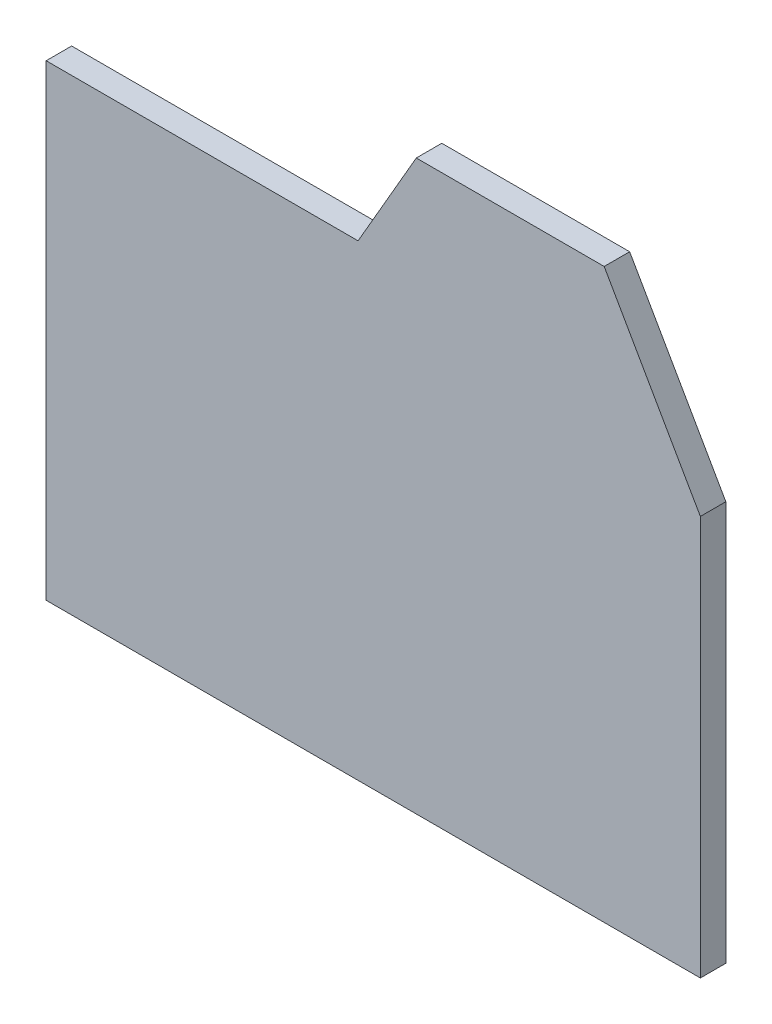
ISO-10303-21;
HEADER;
FILE_DESCRIPTION(('STEP AP214'),'2;1');
FILE_NAME('part.step','',(''),(''),'','','');
FILE_SCHEMA(('AUTOMOTIVE_DESIGN { 1 0 10303 214 1 1 1 1 }'));
ENDSEC;
DATA;
#1=APPLICATION_CONTEXT('core data for automotive mechanical design processes');
#2=APPLICATION_PROTOCOL_DEFINITION('international standard','automotive_design',2000,#1);
#3=PRODUCT_CONTEXT('',#1,'mechanical');
#4=PRODUCT('Part','Part','',(#3));
#5=PRODUCT_RELATED_PRODUCT_CATEGORY('part','',(#4));
#6=PRODUCT_DEFINITION_FORMATION('','',#4);
#7=PRODUCT_DEFINITION_CONTEXT('part definition',#1,'design');
#8=PRODUCT_DEFINITION('design','',#6,#7);
#9=PRODUCT_DEFINITION_SHAPE('','',#8);
#10=(LENGTH_UNIT() NAMED_UNIT(*) SI_UNIT(.MILLI.,.METRE.));
#11=(NAMED_UNIT(*) PLANE_ANGLE_UNIT() SI_UNIT($,.RADIAN.));
#12=(NAMED_UNIT(*) SI_UNIT($,.STERADIAN.) SOLID_ANGLE_UNIT());
#13=UNCERTAINTY_MEASURE_WITH_UNIT(LENGTH_MEASURE(1.E-05),#10,'distance_accuracy_value','');
#14=(GEOMETRIC_REPRESENTATION_CONTEXT(3) GLOBAL_UNCERTAINTY_ASSIGNED_CONTEXT((#13)) GLOBAL_UNIT_ASSIGNED_CONTEXT((#10,
#11,#12)) REPRESENTATION_CONTEXT('',''));
#15=CARTESIAN_POINT('',(0.,0.,0.));
#16=DIRECTION('',(0.,0.,1.));
#17=DIRECTION('',(1.,0.,0.));
#18=AXIS2_PLACEMENT_3D('',#15,#16,#17);
#19=CARTESIAN_POINT('',(78.3220894613165,44.7341186455737,3.));
#20=DIRECTION('',(0.868345141419592,0.495960396980433,0.));
#21=DIRECTION('',(-0.495960396980433,0.868345141419592,0.));
#22=AXIS2_PLACEMENT_3D('',#19,#20,#21);
#23=PLANE('',#22);
#24=DIRECTION('',(0.495960396980433,-0.868345141419592,0.));
#25=VECTOR('',#24,1.);
#26=CARTESIAN_POINT('',(78.3220894613165,44.7341186455737,0.));
#27=LINE('',#26,#25);
#28=CARTESIAN_POINT('',(65.6794,66.86939,0.));
#29=VERTEX_POINT('',#28);
#30=CARTESIAN_POINT('',(77.,47.04888,0.));
#31=VERTEX_POINT('',#30);
#32=EDGE_CURVE('E129',#29,#31,#27,.T.);
#33=ORIENTED_EDGE('',*,*,#32,.F.);
#34=DIRECTION('',(0.,0.,-1.));
#35=VECTOR('',#34,1.);
#36=CARTESIAN_POINT('',(65.6794,66.86939,3.));
#37=LINE('',#36,#35);
#38=CARTESIAN_POINT('',(65.6794,66.86939,3.));
#39=VERTEX_POINT('',#38);
#40=EDGE_CURVE('E11',#39,#29,#37,.T.);
#41=ORIENTED_EDGE('',*,*,#40,.F.);
#42=DIRECTION('',(0.495960396980433,-0.868345141419592,0.));
#43=VECTOR('',#42,1.);
#44=CARTESIAN_POINT('',(78.3220894613165,44.7341186455737,3.));
#45=LINE('',#44,#43);
#46=CARTESIAN_POINT('',(77.,47.04888,3.));
#47=VERTEX_POINT('',#46);
#48=EDGE_CURVE('E145',#39,#47,#45,.T.);
#49=ORIENTED_EDGE('',*,*,#48,.T.);
#50=DIRECTION('',(0.,0.,-1.));
#51=VECTOR('',#50,1.);
#52=CARTESIAN_POINT('',(77.,47.04888,3.));
#53=LINE('',#52,#51);
#54=EDGE_CURVE('E88',#47,#31,#53,.T.);
#55=ORIENTED_EDGE('',*,*,#54,.T.);
#56=EDGE_LOOP('',(#33,#41,#49,#55));
#57=FACE_BOUND('',#56,.T.);
#58=ADVANCED_FACE('F41',(#57),#23,.T.);
#59=CARTESIAN_POINT('',(0.,66.86939,3.));
#60=DIRECTION('',(0.,1.,0.));
#61=DIRECTION('',(0.,0.,1.));
#62=AXIS2_PLACEMENT_3D('',#59,#60,#61);
#63=PLANE('',#62);
#64=DIRECTION('',(1.,0.,0.));
#65=VECTOR('',#64,1.);
#66=CARTESIAN_POINT('',(0.,66.86939,0.));
#67=LINE('',#66,#65);
#68=CARTESIAN_POINT('',(43.56615,66.86939,0.));
#69=VERTEX_POINT('',#68);
#70=EDGE_CURVE('E132',#69,#29,#67,.T.);
#71=ORIENTED_EDGE('',*,*,#70,.F.);
#72=DIRECTION('',(0.,0.,-1.));
#73=VECTOR('',#72,1.);
#74=CARTESIAN_POINT('',(43.56615,66.86939,3.));
#75=LINE('',#74,#73);
#76=CARTESIAN_POINT('',(43.56615,66.86939,3.));
#77=VERTEX_POINT('',#76);
#78=EDGE_CURVE('E49',#77,#69,#75,.T.);
#79=ORIENTED_EDGE('',*,*,#78,.F.);
#80=DIRECTION('',(1.,0.,0.));
#81=VECTOR('',#80,1.);
#82=CARTESIAN_POINT('',(0.,66.86939,3.));
#83=LINE('',#82,#81);
#84=EDGE_CURVE('E164',#77,#39,#83,.T.);
#85=ORIENTED_EDGE('',*,*,#84,.T.);
#86=ORIENTED_EDGE('',*,*,#40,.T.);
#87=EDGE_LOOP('',(#71,#79,#85,#86));
#88=FACE_BOUND('',#87,.T.);
#89=ADVANCED_FACE('F158',(#88),#63,.T.);
#90=CARTESIAN_POINT('',(3.71929707931593,-2.14733857638313,3.));
#91=DIRECTION('',(-0.866025261979014,0.50000024561412,0.));
#92=DIRECTION('',(-0.50000024561412,-0.866025261979014,0.));
#93=AXIS2_PLACEMENT_3D('',#90,#91,#92);
#94=PLANE('',#93);
#95=DIRECTION('',(0.50000024561412,0.866025261979014,0.));
#96=VECTOR('',#95,1.);
#97=CARTESIAN_POINT('',(3.71929707931593,-2.14733857638313,0.));
#98=LINE('',#97,#96);
#99=CARTESIAN_POINT('',(36.71335,55.,0.));
#100=VERTEX_POINT('',#99);
#101=EDGE_CURVE('E135',#100,#69,#98,.T.);
#102=ORIENTED_EDGE('',*,*,#101,.F.);
#103=DIRECTION('',(0.,0.,-1.));
#104=VECTOR('',#103,1.);
#105=CARTESIAN_POINT('',(36.71335,55.,3.));
#106=LINE('',#105,#104);
#107=CARTESIAN_POINT('',(36.71335,55.,3.));
#108=VERTEX_POINT('',#107);
#109=EDGE_CURVE('E149',#108,#100,#106,.T.);
#110=ORIENTED_EDGE('',*,*,#109,.F.);
#111=DIRECTION('',(0.50000024561412,0.866025261979014,0.));
#112=VECTOR('',#111,1.);
#113=CARTESIAN_POINT('',(3.71929707931593,-2.14733857638313,3.));
#114=LINE('',#113,#112);
#115=EDGE_CURVE('E124',#108,#77,#114,.T.);
#116=ORIENTED_EDGE('',*,*,#115,.T.);
#117=ORIENTED_EDGE('',*,*,#78,.T.);
#118=EDGE_LOOP('',(#102,#110,#116,#117));
#119=FACE_BOUND('',#118,.T.);
#120=ADVANCED_FACE('F154',(#119),#94,.T.);
#121=CARTESIAN_POINT('',(0.,55.,3.));
#122=DIRECTION('',(0.,1.,0.));
#123=DIRECTION('',(0.,0.,1.));
#124=AXIS2_PLACEMENT_3D('',#121,#122,#123);
#125=PLANE('',#124);
#126=DIRECTION('',(1.,0.,0.));
#127=VECTOR('',#126,1.);
#128=CARTESIAN_POINT('',(0.,55.,0.));
#129=LINE('',#128,#127);
#130=CARTESIAN_POINT('',(0.,55.,0.));
#131=VERTEX_POINT('',#130);
#132=EDGE_CURVE('E138',#131,#100,#129,.T.);
#133=ORIENTED_EDGE('',*,*,#132,.F.);
#134=DIRECTION('',(0.,0.,-1.));
#135=VECTOR('',#134,1.);
#136=CARTESIAN_POINT('',(0.,55.,3.));
#137=LINE('',#136,#135);
#138=CARTESIAN_POINT('',(0.,55.,3.));
#139=VERTEX_POINT('',#138);
#140=EDGE_CURVE('E112',#139,#131,#137,.T.);
#141=ORIENTED_EDGE('',*,*,#140,.F.);
#142=DIRECTION('',(1.,0.,0.));
#143=VECTOR('',#142,1.);
#144=CARTESIAN_POINT('',(0.,55.,3.));
#145=LINE('',#144,#143);
#146=EDGE_CURVE('E122',#139,#108,#145,.T.);
#147=ORIENTED_EDGE('',*,*,#146,.T.);
#148=ORIENTED_EDGE('',*,*,#109,.T.);
#149=EDGE_LOOP('',(#133,#141,#147,#148));
#150=FACE_BOUND('',#149,.T.);
#151=ADVANCED_FACE('F163',(#150),#125,.T.);
#152=CARTESIAN_POINT('',(0.,0.,3.));
#153=DIRECTION('',(-1.,0.,0.));
#154=DIRECTION('',(0.,0.,1.));
#155=AXIS2_PLACEMENT_3D('',#152,#153,#154);
#156=PLANE('',#155);
#157=DIRECTION('',(0.,1.,0.));
#158=VECTOR('',#157,1.);
#159=CARTESIAN_POINT('',(0.,0.,0.));
#160=LINE('',#159,#158);
#161=CARTESIAN_POINT('',(0.,0.,0.));
#162=VERTEX_POINT('',#161);
#163=EDGE_CURVE('E111',#162,#131,#160,.T.);
#164=ORIENTED_EDGE('',*,*,#163,.F.);
#165=DIRECTION('',(0.,0.,-1.));
#166=VECTOR('',#165,1.);
#167=CARTESIAN_POINT('',(0.,0.,3.));
#168=LINE('',#167,#166);
#169=CARTESIAN_POINT('',(0.,0.,3.));
#170=VERTEX_POINT('',#169);
#171=EDGE_CURVE('E105',#170,#162,#168,.T.);
#172=ORIENTED_EDGE('',*,*,#171,.F.);
#173=DIRECTION('',(0.,1.,0.));
#174=VECTOR('',#173,1.);
#175=CARTESIAN_POINT('',(0.,0.,3.));
#176=LINE('',#175,#174);
#177=EDGE_CURVE('E109',#170,#139,#176,.T.);
#178=ORIENTED_EDGE('',*,*,#177,.T.);
#179=ORIENTED_EDGE('',*,*,#140,.T.);
#180=EDGE_LOOP('',(#164,#172,#178,#179));
#181=FACE_BOUND('',#180,.T.);
#182=ADVANCED_FACE('F107',(#181),#156,.T.);
#183=CARTESIAN_POINT('',(0.,0.,3.));
#184=DIRECTION('',(0.,1.,0.));
#185=DIRECTION('',(0.,0.,1.));
#186=AXIS2_PLACEMENT_3D('',#183,#184,#185);
#187=PLANE('',#186);
#188=DIRECTION('',(1.,0.,0.));
#189=VECTOR('',#188,1.);
#190=CARTESIAN_POINT('',(0.,0.,0.));
#191=LINE('',#190,#189);
#192=CARTESIAN_POINT('',(77.,0.,0.));
#193=VERTEX_POINT('',#192);
#194=EDGE_CURVE('E81',#162,#193,#191,.T.);
#195=ORIENTED_EDGE('',*,*,#194,.T.);
#196=DIRECTION('',(0.,0.,-1.));
#197=VECTOR('',#196,1.);
#198=CARTESIAN_POINT('',(77.,0.,3.));
#199=LINE('',#198,#197);
#200=CARTESIAN_POINT('',(77.,0.,3.));
#201=VERTEX_POINT('',#200);
#202=EDGE_CURVE('E113',#201,#193,#199,.T.);
#203=ORIENTED_EDGE('',*,*,#202,.F.);
#204=DIRECTION('',(1.,0.,0.));
#205=VECTOR('',#204,1.);
#206=CARTESIAN_POINT('',(0.,0.,3.));
#207=LINE('',#206,#205);
#208=EDGE_CURVE('E115',#170,#201,#207,.T.);
#209=ORIENTED_EDGE('',*,*,#208,.F.);
#210=ORIENTED_EDGE('',*,*,#171,.T.);
#211=EDGE_LOOP('',(#195,#203,#209,#210));
#212=FACE_BOUND('',#211,.T.);
#213=ADVANCED_FACE('F116',(#212),#187,.F.);
#214=CARTESIAN_POINT('',(77.,0.,3.));
#215=DIRECTION('',(-1.,0.,0.));
#216=DIRECTION('',(0.,0.,1.));
#217=AXIS2_PLACEMENT_3D('',#214,#215,#216);
#218=PLANE('',#217);
#219=DIRECTION('',(0.,1.,0.));
#220=VECTOR('',#219,1.);
#221=CARTESIAN_POINT('',(77.,0.,0.));
#222=LINE('',#221,#220);
#223=EDGE_CURVE('E143',#193,#31,#222,.T.);
#224=ORIENTED_EDGE('',*,*,#223,.T.);
#225=ORIENTED_EDGE('',*,*,#54,.F.);
#226=DIRECTION('',(0.,1.,0.));
#227=VECTOR('',#226,1.);
#228=CARTESIAN_POINT('',(77.,0.,3.));
#229=LINE('',#228,#227);
#230=EDGE_CURVE('E57',#201,#47,#229,.T.);
#231=ORIENTED_EDGE('',*,*,#230,.F.);
#232=ORIENTED_EDGE('',*,*,#202,.T.);
#233=EDGE_LOOP('',(#224,#225,#231,#232));
#234=FACE_BOUND('',#233,.T.);
#235=ADVANCED_FACE('F182',(#234),#218,.F.);
#236=CARTESIAN_POINT('',(0.,0.,3.));
#237=DIRECTION('',(0.,0.,1.));
#238=DIRECTION('',(1.,0.,0.));
#239=AXIS2_PLACEMENT_3D('',#236,#237,#238);
#240=PLANE('',#239);
#241=ORIENTED_EDGE('',*,*,#48,.F.);
#242=ORIENTED_EDGE('',*,*,#84,.F.);
#243=ORIENTED_EDGE('',*,*,#115,.F.);
#244=ORIENTED_EDGE('',*,*,#146,.F.);
#245=ORIENTED_EDGE('',*,*,#177,.F.);
#246=ORIENTED_EDGE('',*,*,#208,.T.);
#247=ORIENTED_EDGE('',*,*,#230,.T.);
#248=EDGE_LOOP('',(#241,#242,#243,#244,#245,#246,#247));
#249=FACE_BOUND('',#248,.T.);
#250=ADVANCED_FACE('F119',(#249),#240,.T.);
#251=CARTESIAN_POINT('',(0.,0.,0.));
#252=DIRECTION('',(0.,0.,1.));
#253=DIRECTION('',(1.,0.,0.));
#254=AXIS2_PLACEMENT_3D('',#251,#252,#253);
#255=PLANE('',#254);
#256=ORIENTED_EDGE('',*,*,#32,.T.);
#257=ORIENTED_EDGE('',*,*,#223,.F.);
#258=ORIENTED_EDGE('',*,*,#194,.F.);
#259=ORIENTED_EDGE('',*,*,#163,.T.);
#260=ORIENTED_EDGE('',*,*,#132,.T.);
#261=ORIENTED_EDGE('',*,*,#101,.T.);
#262=ORIENTED_EDGE('',*,*,#70,.T.);
#263=EDGE_LOOP('',(#256,#257,#258,#259,#260,#261,#262));
#264=FACE_BOUND('',#263,.T.);
#265=ADVANCED_FACE('F160',(#264),#255,.F.);
#266=CLOSED_SHELL('',(#58,#89,#120,#151,#182,#213,#235,#250,#265));
#267=MANIFOLD_SOLID_BREP('B2',#266);
#268=ADVANCED_BREP_SHAPE_REPRESENTATION('',(#18,#267),#14);
#269=SHAPE_DEFINITION_REPRESENTATION(#9,#268);
ENDSEC;
END-ISO-10303-21;
